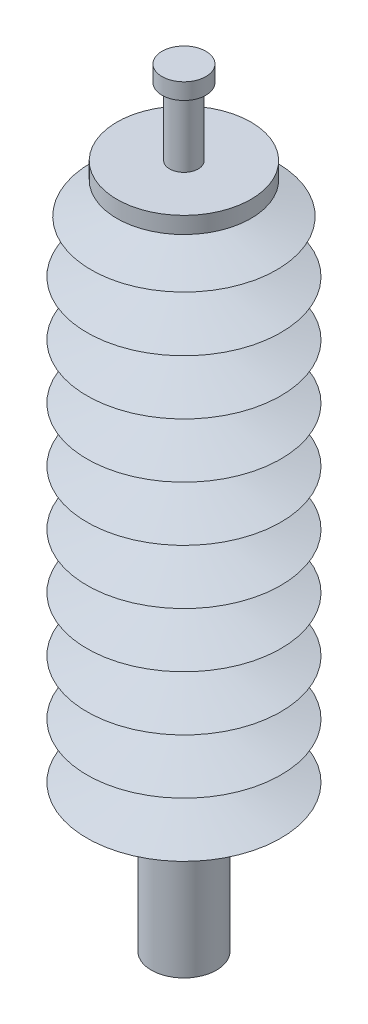
ISO-10303-21;
HEADER;
FILE_DESCRIPTION(('STEP AP214'),'2;1');
FILE_NAME('part.step','',(''),(''),'','','');
FILE_SCHEMA(('AUTOMOTIVE_DESIGN { 1 0 10303 214 1 1 1 1 }'));
ENDSEC;
DATA;
#1=APPLICATION_CONTEXT('core data for automotive mechanical design processes');
#2=APPLICATION_PROTOCOL_DEFINITION('international standard','automotive_design',2000,#1);
#3=PRODUCT_CONTEXT('',#1,'mechanical');
#4=PRODUCT('Part','Part','',(#3));
#5=PRODUCT_RELATED_PRODUCT_CATEGORY('part','',(#4));
#6=PRODUCT_DEFINITION_FORMATION('','',#4);
#7=PRODUCT_DEFINITION_CONTEXT('part definition',#1,'design');
#8=PRODUCT_DEFINITION('design','',#6,#7);
#9=PRODUCT_DEFINITION_SHAPE('','',#8);
#10=(LENGTH_UNIT() NAMED_UNIT(*) SI_UNIT(.MILLI.,.METRE.));
#11=(NAMED_UNIT(*) PLANE_ANGLE_UNIT() SI_UNIT($,.RADIAN.));
#12=(NAMED_UNIT(*) SI_UNIT($,.STERADIAN.) SOLID_ANGLE_UNIT());
#13=UNCERTAINTY_MEASURE_WITH_UNIT(LENGTH_MEASURE(1.E-05),#10,'distance_accuracy_value','');
#14=(GEOMETRIC_REPRESENTATION_CONTEXT(3) GLOBAL_UNCERTAINTY_ASSIGNED_CONTEXT((#13)) GLOBAL_UNIT_ASSIGNED_CONTEXT((#10,
#11,#12)) REPRESENTATION_CONTEXT('',''));
#15=CARTESIAN_POINT('',(0.,0.,0.));
#16=DIRECTION('',(0.,0.,1.));
#17=DIRECTION('',(1.,0.,0.));
#18=AXIS2_PLACEMENT_3D('',#15,#16,#17);
#19=CARTESIAN_POINT('',(50.,0.,0.));
#20=DIRECTION('',(0.,-1.,0.));
#21=DIRECTION('',(0.,0.,-1.));
#22=AXIS2_PLACEMENT_3D('',#19,#20,#21);
#23=PLANE('',#22);
#24=CARTESIAN_POINT('',(0.,0.,0.));
#25=DIRECTION('',(0.,-1.,0.));
#26=DIRECTION('',(0.,0.,-1.));
#27=AXIS2_PLACEMENT_3D('',#24,#25,#26);
#28=CIRCLE('',#27,50.);
#29=CARTESIAN_POINT('',(0.,0.,-50.));
#30=VERTEX_POINT('',#29);
#31=EDGE_CURVE('E122',#30,#30,#28,.T.);
#32=ORIENTED_EDGE('',*,*,#31,.T.);
#33=EDGE_LOOP('',(#32));
#34=FACE_BOUND('',#33,.T.);
#35=ADVANCED_FACE('F31',(#34),#23,.T.);
#36=CARTESIAN_POINT('',(33.6784208654145,1179.59682521673,0.));
#37=DIRECTION('',(0.,1.,0.));
#38=DIRECTION('',(0.,0.,1.));
#39=AXIS2_PLACEMENT_3D('',#36,#37,#38);
#40=PLANE('',#39);
#41=CARTESIAN_POINT('',(0.,1179.59682521673,0.));
#42=DIRECTION('',(0.,-1.,0.));
#43=DIRECTION('',(0.,0.,-1.));
#44=AXIS2_PLACEMENT_3D('',#41,#42,#43);
#45=CIRCLE('',#44,33.6784208654145);
#46=CARTESIAN_POINT('',(0.,1179.59682521673,-33.6784208654145));
#47=VERTEX_POINT('',#46);
#48=EDGE_CURVE('E10',#47,#47,#45,.T.);
#49=ORIENTED_EDGE('',*,*,#48,.F.);
#50=EDGE_LOOP('',(#49));
#51=FACE_BOUND('',#50,.T.);
#52=ADVANCED_FACE('F139',(#51),#40,.T.);
#53=CARTESIAN_POINT('',(0.,0.,0.));
#54=DIRECTION('',(0.,-1.,0.));
#55=DIRECTION('',(0.,0.,-1.));
#56=AXIS2_PLACEMENT_3D('',#53,#54,#55);
#57=CYLINDRICAL_SURFACE('',#56,33.6784208654145);
#58=ORIENTED_EDGE('',*,*,#48,.T.);
#59=EDGE_LOOP('',(#58));
#60=FACE_BOUND('',#59,.T.);
#61=CARTESIAN_POINT('',(0.,1154.72902220655,0.));
#62=DIRECTION('',(0.,-1.,0.));
#63=DIRECTION('',(0.,0.,-1.));
#64=AXIS2_PLACEMENT_3D('',#61,#62,#63);
#65=CIRCLE('',#64,33.6784208654145);
#66=CARTESIAN_POINT('',(0.,1154.72902220655,-33.6784208654145));
#67=VERTEX_POINT('',#66);
#68=EDGE_CURVE('E37',#67,#67,#65,.T.);
#69=ORIENTED_EDGE('',*,*,#68,.F.);
#70=EDGE_LOOP('',(#69));
#71=FACE_BOUND('',#70,.T.);
#72=ADVANCED_FACE('F143',(#60,#71),#57,.T.);
#73=CARTESIAN_POINT('',(21.9877502011123,1154.72902220655,0.));
#74=DIRECTION('',(0.,-1.,0.));
#75=DIRECTION('',(0.,0.,-1.));
#76=AXIS2_PLACEMENT_3D('',#73,#74,#75);
#77=PLANE('',#76);
#78=ORIENTED_EDGE('',*,*,#68,.T.);
#79=EDGE_LOOP('',(#78));
#80=FACE_BOUND('',#79,.T.);
#81=CARTESIAN_POINT('',(0.,1154.72902220655,0.));
#82=DIRECTION('',(0.,-1.,0.));
#83=DIRECTION('',(0.,0.,-1.));
#84=AXIS2_PLACEMENT_3D('',#81,#82,#83);
#85=CIRCLE('',#84,21.9877502011123);
#86=CARTESIAN_POINT('',(0.,1154.72902220655,-21.9877502011123));
#87=VERTEX_POINT('',#86);
#88=EDGE_CURVE('E41',#87,#87,#85,.T.);
#89=ORIENTED_EDGE('',*,*,#88,.F.);
#90=EDGE_LOOP('',(#89));
#91=FACE_BOUND('',#90,.T.);
#92=ADVANCED_FACE('F148',(#80,#91),#77,.T.);
#93=CARTESIAN_POINT('',(0.,0.,0.));
#94=DIRECTION('',(0.,-1.,0.));
#95=DIRECTION('',(0.,0.,-1.));
#96=AXIS2_PLACEMENT_3D('',#93,#94,#95);
#97=CYLINDRICAL_SURFACE('',#96,21.9877502011123);
#98=ORIENTED_EDGE('',*,*,#88,.T.);
#99=EDGE_LOOP('',(#98));
#100=FACE_BOUND('',#99,.T.);
#101=CARTESIAN_POINT('',(0.,1050.93932575058,0.));
#102=DIRECTION('',(0.,-1.,0.));
#103=DIRECTION('',(0.,0.,-1.));
#104=AXIS2_PLACEMENT_3D('',#101,#102,#103);
#105=CIRCLE('',#104,21.9877502011123);
#106=CARTESIAN_POINT('',(0.,1050.93932575058,-21.9877502011123));
#107=VERTEX_POINT('',#106);
#108=EDGE_CURVE('E45',#107,#107,#105,.T.);
#109=ORIENTED_EDGE('',*,*,#108,.F.);
#110=EDGE_LOOP('',(#109));
#111=FACE_BOUND('',#110,.T.);
#112=ADVANCED_FACE('F153',(#100,#111),#97,.T.);
#113=CARTESIAN_POINT('',(21.9877502011123,1050.93932575058,0.));
#114=DIRECTION('',(0.,1.,0.));
#115=DIRECTION('',(0.,0.,1.));
#116=AXIS2_PLACEMENT_3D('',#113,#114,#115);
#117=PLANE('',#116);
#118=ORIENTED_EDGE('',*,*,#108,.T.);
#119=EDGE_LOOP('',(#118));
#120=FACE_BOUND('',#119,.T.);
#121=CARTESIAN_POINT('',(0.,1050.93932575058,0.));
#122=DIRECTION('',(0.,-1.,0.));
#123=DIRECTION('',(0.,0.,-1.));
#124=AXIS2_PLACEMENT_3D('',#121,#122,#123);
#125=CIRCLE('',#124,102.820969976905);
#126=CARTESIAN_POINT('',(0.,1050.93932575058,-102.820969976905));
#127=VERTEX_POINT('',#126);
#128=EDGE_CURVE('E50',#127,#127,#125,.T.);
#129=ORIENTED_EDGE('',*,*,#128,.F.);
#130=EDGE_LOOP('',(#129));
#131=FACE_BOUND('',#130,.T.);
#132=ADVANCED_FACE('F156',(#120,#131),#117,.T.);
#133=CARTESIAN_POINT('',(0.,0.,0.));
#134=DIRECTION('',(0.,-1.,0.));
#135=DIRECTION('',(0.,0.,-1.));
#136=AXIS2_PLACEMENT_3D('',#133,#134,#135);
#137=CYLINDRICAL_SURFACE('',#136,102.820969976905);
#138=ORIENTED_EDGE('',*,*,#128,.T.);
#139=EDGE_LOOP('',(#138));
#140=FACE_BOUND('',#139,.T.);
#141=CARTESIAN_POINT('',(0.,1025.46966287529,0.));
#142=DIRECTION('',(0.,-1.,0.));
#143=DIRECTION('',(0.,0.,-1.));
#144=AXIS2_PLACEMENT_3D('',#141,#142,#143);
#145=CIRCLE('',#144,102.820969976905);
#146=CARTESIAN_POINT('',(0.,1025.46966287529,-102.820969976905));
#147=VERTEX_POINT('',#146);
#148=EDGE_CURVE('E53',#147,#147,#145,.T.);
#149=ORIENTED_EDGE('',*,*,#148,.F.);
#150=EDGE_LOOP('',(#149));
#151=FACE_BOUND('',#150,.T.);
#152=ADVANCED_FACE('F160',(#140,#151),#137,.T.);
#153=CARTESIAN_POINT('',(102.820969976905,1025.46966287529,0.));
#154=DIRECTION('',(0.,-1.,0.));
#155=DIRECTION('',(0.,0.,-1.));
#156=AXIS2_PLACEMENT_3D('',#153,#154,#155);
#157=PLANE('',#156);
#158=ORIENTED_EDGE('',*,*,#148,.T.);
#159=EDGE_LOOP('',(#158));
#160=FACE_BOUND('',#159,.T.);
#161=CARTESIAN_POINT('',(0.,1025.46966287529,0.));
#162=DIRECTION('',(0.,-1.,0.));
#163=DIRECTION('',(0.,0.,-1.));
#164=AXIS2_PLACEMENT_3D('',#161,#162,#163);
#165=CIRCLE('',#164,49.9999999999995);
#166=CARTESIAN_POINT('',(0.,1025.46966287529,-49.9999999999995));
#167=VERTEX_POINT('',#166);
#168=EDGE_CURVE('E56',#167,#167,#165,.T.);
#169=ORIENTED_EDGE('',*,*,#168,.F.);
#170=EDGE_LOOP('',(#169));
#171=FACE_BOUND('',#170,.T.);
#172=ADVANCED_FACE('F164',(#160,#171),#157,.T.);
#173=CARTESIAN_POINT('',(0.,0.,0.));
#174=DIRECTION('',(0.,-1.,0.));
#175=DIRECTION('',(0.,0.,-1.));
#176=AXIS2_PLACEMENT_3D('',#173,#174,#175);
#177=CYLINDRICAL_SURFACE('',#176,49.9999999999996);
#178=ORIENTED_EDGE('',*,*,#168,.T.);
#179=EDGE_LOOP('',(#178));
#180=FACE_BOUND('',#179,.T.);
#181=CARTESIAN_POINT('',(0.,1000.,0.));
#182=DIRECTION('',(0.,-1.,0.));
#183=DIRECTION('',(0.,0.,-1.));
#184=AXIS2_PLACEMENT_3D('',#181,#182,#183);
#185=CIRCLE('',#184,49.9999999999996);
#186=CARTESIAN_POINT('',(0.,1000.,-49.9999999999996));
#187=VERTEX_POINT('',#186);
#188=EDGE_CURVE('E59',#187,#187,#185,.T.);
#189=ORIENTED_EDGE('',*,*,#188,.F.);
#190=EDGE_LOOP('',(#189));
#191=FACE_BOUND('',#190,.T.);
#192=ADVANCED_FACE('F168',(#180,#191),#177,.T.);
#193=CARTESIAN_POINT('',(0.,976.98996778291,0.));
#194=DIRECTION('',(0.,-1.,0.));
#195=DIRECTION('',(0.,0.,-1.));
#196=AXIS2_PLACEMENT_3D('',#193,#194,#195);
#197=CONICAL_SURFACE('',#196,142.436697459584,1.32682736848839);
#198=ORIENTED_EDGE('',*,*,#188,.T.);
#199=EDGE_LOOP('',(#198));
#200=FACE_BOUND('',#199,.T.);
#201=CARTESIAN_POINT('',(0.,976.98996778291,0.));
#202=DIRECTION('',(0.,-1.,0.));
#203=DIRECTION('',(0.,0.,-1.));
#204=AXIS2_PLACEMENT_3D('',#201,#202,#203);
#205=CIRCLE('',#204,142.436697459584);
#206=CARTESIAN_POINT('',(0.,976.98996778291,-142.436697459584));
#207=VERTEX_POINT('',#206);
#208=EDGE_CURVE('E62',#207,#207,#205,.T.);
#209=ORIENTED_EDGE('',*,*,#208,.F.);
#210=EDGE_LOOP('',(#209));
#211=FACE_BOUND('',#210,.T.);
#212=ADVANCED_FACE('F172',(#200,#211),#197,.T.);
#213=CARTESIAN_POINT('',(0.,921.400938378422,0.));
#214=DIRECTION('',(0.,1.,0.));
#215=DIRECTION('',(0.,0.,1.));
#216=AXIS2_PLACEMENT_3D('',#213,#214,#215);
#217=CONICAL_SURFACE('',#216,49.9999999999996,1.02936712170393);
#218=ORIENTED_EDGE('',*,*,#208,.T.);
#219=EDGE_LOOP('',(#218));
#220=FACE_BOUND('',#219,.T.);
#221=CARTESIAN_POINT('',(0.,921.400938378422,0.));
#222=DIRECTION('',(0.,-1.,0.));
#223=DIRECTION('',(0.,0.,-1.));
#224=AXIS2_PLACEMENT_3D('',#221,#222,#223);
#225=CIRCLE('',#224,49.9999999999996);
#226=CARTESIAN_POINT('',(0.,921.400938378422,-49.9999999999996));
#227=VERTEX_POINT('',#226);
#228=EDGE_CURVE('E65',#227,#227,#225,.T.);
#229=ORIENTED_EDGE('',*,*,#228,.F.);
#230=EDGE_LOOP('',(#229));
#231=FACE_BOUND('',#230,.T.);
#232=ADVANCED_FACE('F176',(#220,#231),#217,.T.);
#233=CARTESIAN_POINT('',(0.,896.810317934068,0.));
#234=DIRECTION('',(0.,-1.,0.));
#235=DIRECTION('',(0.,0.,-1.));
#236=AXIS2_PLACEMENT_3D('',#233,#234,#235);
#237=CONICAL_SURFACE('',#236,148.786291166946,1.32682736848839);
#238=ORIENTED_EDGE('',*,*,#228,.T.);
#239=EDGE_LOOP('',(#238));
#240=FACE_BOUND('',#239,.T.);
#241=CARTESIAN_POINT('',(0.,896.810317934068,0.));
#242=DIRECTION('',(0.,-1.,0.));
#243=DIRECTION('',(0.,0.,-1.));
#244=AXIS2_PLACEMENT_3D('',#241,#242,#243);
#245=CIRCLE('',#244,148.786291166946);
#246=CARTESIAN_POINT('',(0.,896.810317934068,-148.786291166946));
#247=VERTEX_POINT('',#246);
#248=EDGE_CURVE('E68',#247,#247,#245,.T.);
#249=ORIENTED_EDGE('',*,*,#248,.F.);
#250=EDGE_LOOP('',(#249));
#251=FACE_BOUND('',#250,.T.);
#252=ADVANCED_FACE('F180',(#240,#251),#237,.T.);
#253=CARTESIAN_POINT('',(0.,837.402807763762,0.));
#254=DIRECTION('',(0.,1.,0.));
#255=DIRECTION('',(0.,0.,1.));
#256=AXIS2_PLACEMENT_3D('',#253,#254,#255);
#257=CONICAL_SURFACE('',#256,49.9999999999996,1.02936712170394);
#258=ORIENTED_EDGE('',*,*,#248,.T.);
#259=EDGE_LOOP('',(#258));
#260=FACE_BOUND('',#259,.T.);
#261=CARTESIAN_POINT('',(0.,837.402807763762,0.));
#262=DIRECTION('',(0.,-1.,0.));
#263=DIRECTION('',(0.,0.,-1.));
#264=AXIS2_PLACEMENT_3D('',#261,#262,#263);
#265=CIRCLE('',#264,49.9999999999996);
#266=CARTESIAN_POINT('',(0.,837.402807763762,-49.9999999999996));
#267=VERTEX_POINT('',#266);
#268=EDGE_CURVE('E71',#267,#267,#265,.T.);
#269=ORIENTED_EDGE('',*,*,#268,.F.);
#270=EDGE_LOOP('',(#269));
#271=FACE_BOUND('',#270,.T.);
#272=ADVANCED_FACE('F184',(#260,#271),#257,.T.);
#273=CARTESIAN_POINT('',(0.,812.812187319408,0.));
#274=DIRECTION('',(0.,-1.,0.));
#275=DIRECTION('',(0.,0.,-1.));
#276=AXIS2_PLACEMENT_3D('',#273,#274,#275);
#277=CONICAL_SURFACE('',#276,148.786291166946,1.32682736848839);
#278=ORIENTED_EDGE('',*,*,#268,.T.);
#279=EDGE_LOOP('',(#278));
#280=FACE_BOUND('',#279,.T.);
#281=CARTESIAN_POINT('',(0.,812.812187319408,0.));
#282=DIRECTION('',(0.,-1.,0.));
#283=DIRECTION('',(0.,0.,-1.));
#284=AXIS2_PLACEMENT_3D('',#281,#282,#283);
#285=CIRCLE('',#284,148.786291166946);
#286=CARTESIAN_POINT('',(0.,812.812187319408,-148.786291166946));
#287=VERTEX_POINT('',#286);
#288=EDGE_CURVE('E74',#287,#287,#285,.T.);
#289=ORIENTED_EDGE('',*,*,#288,.F.);
#290=EDGE_LOOP('',(#289));
#291=FACE_BOUND('',#290,.T.);
#292=ADVANCED_FACE('F188',(#280,#291),#277,.T.);
#293=CARTESIAN_POINT('',(0.,753.404677149102,0.));
#294=DIRECTION('',(0.,1.,0.));
#295=DIRECTION('',(0.,0.,1.));
#296=AXIS2_PLACEMENT_3D('',#293,#294,#295);
#297=CONICAL_SURFACE('',#296,49.9999999999996,1.02936712170394);
#298=ORIENTED_EDGE('',*,*,#288,.T.);
#299=EDGE_LOOP('',(#298));
#300=FACE_BOUND('',#299,.T.);
#301=CARTESIAN_POINT('',(0.,753.404677149102,0.));
#302=DIRECTION('',(0.,-1.,0.));
#303=DIRECTION('',(0.,0.,-1.));
#304=AXIS2_PLACEMENT_3D('',#301,#302,#303);
#305=CIRCLE('',#304,49.9999999999996);
#306=CARTESIAN_POINT('',(0.,753.404677149102,-49.9999999999996));
#307=VERTEX_POINT('',#306);
#308=EDGE_CURVE('E77',#307,#307,#305,.T.);
#309=ORIENTED_EDGE('',*,*,#308,.F.);
#310=EDGE_LOOP('',(#309));
#311=FACE_BOUND('',#310,.T.);
#312=ADVANCED_FACE('F192',(#300,#311),#297,.T.);
#313=CARTESIAN_POINT('',(0.,728.814056704748,0.));
#314=DIRECTION('',(0.,-1.,0.));
#315=DIRECTION('',(0.,0.,-1.));
#316=AXIS2_PLACEMENT_3D('',#313,#314,#315);
#317=CONICAL_SURFACE('',#316,148.786291166946,1.32682736848839);
#318=ORIENTED_EDGE('',*,*,#308,.T.);
#319=EDGE_LOOP('',(#318));
#320=FACE_BOUND('',#319,.T.);
#321=CARTESIAN_POINT('',(0.,728.814056704748,0.));
#322=DIRECTION('',(0.,-1.,0.));
#323=DIRECTION('',(0.,0.,-1.));
#324=AXIS2_PLACEMENT_3D('',#321,#322,#323);
#325=CIRCLE('',#324,148.786291166946);
#326=CARTESIAN_POINT('',(0.,728.814056704748,-148.786291166946));
#327=VERTEX_POINT('',#326);
#328=EDGE_CURVE('E80',#327,#327,#325,.T.);
#329=ORIENTED_EDGE('',*,*,#328,.F.);
#330=EDGE_LOOP('',(#329));
#331=FACE_BOUND('',#330,.T.);
#332=ADVANCED_FACE('F196',(#320,#331),#317,.T.);
#333=CARTESIAN_POINT('',(0.,669.406546534442,0.));
#334=DIRECTION('',(0.,1.,0.));
#335=DIRECTION('',(0.,0.,1.));
#336=AXIS2_PLACEMENT_3D('',#333,#334,#335);
#337=CONICAL_SURFACE('',#336,49.9999999999997,1.02936712170394);
#338=ORIENTED_EDGE('',*,*,#328,.T.);
#339=EDGE_LOOP('',(#338));
#340=FACE_BOUND('',#339,.T.);
#341=CARTESIAN_POINT('',(0.,669.406546534442,0.));
#342=DIRECTION('',(0.,-1.,0.));
#343=DIRECTION('',(0.,0.,-1.));
#344=AXIS2_PLACEMENT_3D('',#341,#342,#343);
#345=CIRCLE('',#344,49.9999999999997);
#346=CARTESIAN_POINT('',(0.,669.406546534442,-49.9999999999997));
#347=VERTEX_POINT('',#346);
#348=EDGE_CURVE('E83',#347,#347,#345,.T.);
#349=ORIENTED_EDGE('',*,*,#348,.F.);
#350=EDGE_LOOP('',(#349));
#351=FACE_BOUND('',#350,.T.);
#352=ADVANCED_FACE('F200',(#340,#351),#337,.T.);
#353=CARTESIAN_POINT('',(0.,644.815926090088,0.));
#354=DIRECTION('',(0.,-1.,0.));
#355=DIRECTION('',(0.,0.,-1.));
#356=AXIS2_PLACEMENT_3D('',#353,#354,#355);
#357=CONICAL_SURFACE('',#356,148.786291166946,1.32682736848839);
#358=ORIENTED_EDGE('',*,*,#348,.T.);
#359=EDGE_LOOP('',(#358));
#360=FACE_BOUND('',#359,.T.);
#361=CARTESIAN_POINT('',(0.,644.815926090088,0.));
#362=DIRECTION('',(0.,-1.,0.));
#363=DIRECTION('',(0.,0.,-1.));
#364=AXIS2_PLACEMENT_3D('',#361,#362,#363);
#365=CIRCLE('',#364,148.786291166946);
#366=CARTESIAN_POINT('',(0.,644.815926090088,-148.786291166946));
#367=VERTEX_POINT('',#366);
#368=EDGE_CURVE('E86',#367,#367,#365,.T.);
#369=ORIENTED_EDGE('',*,*,#368,.F.);
#370=EDGE_LOOP('',(#369));
#371=FACE_BOUND('',#370,.T.);
#372=ADVANCED_FACE('F204',(#360,#371),#357,.T.);
#373=CARTESIAN_POINT('',(0.,585.408415919782,0.));
#374=DIRECTION('',(0.,1.,0.));
#375=DIRECTION('',(0.,0.,1.));
#376=AXIS2_PLACEMENT_3D('',#373,#374,#375);
#377=CONICAL_SURFACE('',#376,49.9999999999996,1.02936712170394);
#378=ORIENTED_EDGE('',*,*,#368,.T.);
#379=EDGE_LOOP('',(#378));
#380=FACE_BOUND('',#379,.T.);
#381=CARTESIAN_POINT('',(0.,585.408415919782,0.));
#382=DIRECTION('',(0.,-1.,0.));
#383=DIRECTION('',(0.,0.,-1.));
#384=AXIS2_PLACEMENT_3D('',#381,#382,#383);
#385=CIRCLE('',#384,49.9999999999996);
#386=CARTESIAN_POINT('',(0.,585.408415919782,-49.9999999999996));
#387=VERTEX_POINT('',#386);
#388=EDGE_CURVE('E89',#387,#387,#385,.T.);
#389=ORIENTED_EDGE('',*,*,#388,.F.);
#390=EDGE_LOOP('',(#389));
#391=FACE_BOUND('',#390,.T.);
#392=ADVANCED_FACE('F208',(#380,#391),#377,.T.);
#393=CARTESIAN_POINT('',(0.,560.817795475428,0.));
#394=DIRECTION('',(0.,-1.,0.));
#395=DIRECTION('',(0.,0.,-1.));
#396=AXIS2_PLACEMENT_3D('',#393,#394,#395);
#397=CONICAL_SURFACE('',#396,148.786291166946,1.32682736848839);
#398=ORIENTED_EDGE('',*,*,#388,.T.);
#399=EDGE_LOOP('',(#398));
#400=FACE_BOUND('',#399,.T.);
#401=CARTESIAN_POINT('',(0.,560.817795475428,0.));
#402=DIRECTION('',(0.,-1.,0.));
#403=DIRECTION('',(0.,0.,-1.));
#404=AXIS2_PLACEMENT_3D('',#401,#402,#403);
#405=CIRCLE('',#404,148.786291166946);
#406=CARTESIAN_POINT('',(0.,560.817795475428,-148.786291166946));
#407=VERTEX_POINT('',#406);
#408=EDGE_CURVE('E92',#407,#407,#405,.T.);
#409=ORIENTED_EDGE('',*,*,#408,.F.);
#410=EDGE_LOOP('',(#409));
#411=FACE_BOUND('',#410,.T.);
#412=ADVANCED_FACE('F212',(#400,#411),#397,.T.);
#413=CARTESIAN_POINT('',(0.,501.410285305122,0.));
#414=DIRECTION('',(0.,1.,0.));
#415=DIRECTION('',(0.,0.,1.));
#416=AXIS2_PLACEMENT_3D('',#413,#414,#415);
#417=CONICAL_SURFACE('',#416,49.9999999999997,1.02936712170393);
#418=ORIENTED_EDGE('',*,*,#408,.T.);
#419=EDGE_LOOP('',(#418));
#420=FACE_BOUND('',#419,.T.);
#421=CARTESIAN_POINT('',(0.,501.410285305122,0.));
#422=DIRECTION('',(0.,-1.,0.));
#423=DIRECTION('',(0.,0.,-1.));
#424=AXIS2_PLACEMENT_3D('',#421,#422,#423);
#425=CIRCLE('',#424,49.9999999999997);
#426=CARTESIAN_POINT('',(0.,501.410285305122,-49.9999999999997));
#427=VERTEX_POINT('',#426);
#428=EDGE_CURVE('E95',#427,#427,#425,.T.);
#429=ORIENTED_EDGE('',*,*,#428,.F.);
#430=EDGE_LOOP('',(#429));
#431=FACE_BOUND('',#430,.T.);
#432=ADVANCED_FACE('F216',(#420,#431),#417,.T.);
#433=CARTESIAN_POINT('',(0.,476.819664860768,0.));
#434=DIRECTION('',(0.,-1.,0.));
#435=DIRECTION('',(0.,0.,-1.));
#436=AXIS2_PLACEMENT_3D('',#433,#434,#435);
#437=CONICAL_SURFACE('',#436,148.786291166947,1.32682736848839);
#438=ORIENTED_EDGE('',*,*,#428,.T.);
#439=EDGE_LOOP('',(#438));
#440=FACE_BOUND('',#439,.T.);
#441=CARTESIAN_POINT('',(0.,476.819664860768,0.));
#442=DIRECTION('',(0.,-1.,0.));
#443=DIRECTION('',(0.,0.,-1.));
#444=AXIS2_PLACEMENT_3D('',#441,#442,#443);
#445=CIRCLE('',#444,148.786291166947);
#446=CARTESIAN_POINT('',(0.,476.819664860768,-148.786291166947));
#447=VERTEX_POINT('',#446);
#448=EDGE_CURVE('E98',#447,#447,#445,.T.);
#449=ORIENTED_EDGE('',*,*,#448,.F.);
#450=EDGE_LOOP('',(#449));
#451=FACE_BOUND('',#450,.T.);
#452=ADVANCED_FACE('F220',(#440,#451),#437,.T.);
#453=CARTESIAN_POINT('',(0.,417.412154690462,0.));
#454=DIRECTION('',(0.,1.,0.));
#455=DIRECTION('',(0.,0.,1.));
#456=AXIS2_PLACEMENT_3D('',#453,#454,#455);
#457=CONICAL_SURFACE('',#456,49.9999999999998,1.02936712170394);
#458=ORIENTED_EDGE('',*,*,#448,.T.);
#459=EDGE_LOOP('',(#458));
#460=FACE_BOUND('',#459,.T.);
#461=CARTESIAN_POINT('',(0.,417.412154690462,0.));
#462=DIRECTION('',(0.,-1.,0.));
#463=DIRECTION('',(0.,0.,-1.));
#464=AXIS2_PLACEMENT_3D('',#461,#462,#463);
#465=CIRCLE('',#464,49.9999999999998);
#466=CARTESIAN_POINT('',(0.,417.412154690462,-49.9999999999998));
#467=VERTEX_POINT('',#466);
#468=EDGE_CURVE('E101',#467,#467,#465,.T.);
#469=ORIENTED_EDGE('',*,*,#468,.F.);
#470=EDGE_LOOP('',(#469));
#471=FACE_BOUND('',#470,.T.);
#472=ADVANCED_FACE('F224',(#460,#471),#457,.T.);
#473=CARTESIAN_POINT('',(0.,392.821534246108,0.));
#474=DIRECTION('',(0.,-1.,0.));
#475=DIRECTION('',(0.,0.,-1.));
#476=AXIS2_PLACEMENT_3D('',#473,#474,#475);
#477=CONICAL_SURFACE('',#476,148.786291166947,1.32682736848839);
#478=ORIENTED_EDGE('',*,*,#468,.T.);
#479=EDGE_LOOP('',(#478));
#480=FACE_BOUND('',#479,.T.);
#481=CARTESIAN_POINT('',(0.,392.821534246108,0.));
#482=DIRECTION('',(0.,-1.,0.));
#483=DIRECTION('',(0.,0.,-1.));
#484=AXIS2_PLACEMENT_3D('',#481,#482,#483);
#485=CIRCLE('',#484,148.786291166947);
#486=CARTESIAN_POINT('',(0.,392.821534246108,-148.786291166947));
#487=VERTEX_POINT('',#486);
#488=EDGE_CURVE('E104',#487,#487,#485,.T.);
#489=ORIENTED_EDGE('',*,*,#488,.F.);
#490=EDGE_LOOP('',(#489));
#491=FACE_BOUND('',#490,.T.);
#492=ADVANCED_FACE('F228',(#480,#491),#477,.T.);
#493=CARTESIAN_POINT('',(0.,333.414024075802,0.));
#494=DIRECTION('',(0.,1.,0.));
#495=DIRECTION('',(0.,0.,1.));
#496=AXIS2_PLACEMENT_3D('',#493,#494,#495);
#497=CONICAL_SURFACE('',#496,49.9999999999999,1.02936712170394);
#498=ORIENTED_EDGE('',*,*,#488,.T.);
#499=EDGE_LOOP('',(#498));
#500=FACE_BOUND('',#499,.T.);
#501=CARTESIAN_POINT('',(0.,333.414024075802,0.));
#502=DIRECTION('',(0.,-1.,0.));
#503=DIRECTION('',(0.,0.,-1.));
#504=AXIS2_PLACEMENT_3D('',#501,#502,#503);
#505=CIRCLE('',#504,49.9999999999999);
#506=CARTESIAN_POINT('',(0.,333.414024075802,-49.9999999999999));
#507=VERTEX_POINT('',#506);
#508=EDGE_CURVE('E107',#507,#507,#505,.T.);
#509=ORIENTED_EDGE('',*,*,#508,.F.);
#510=EDGE_LOOP('',(#509));
#511=FACE_BOUND('',#510,.T.);
#512=ADVANCED_FACE('F232',(#500,#511),#497,.T.);
#513=CARTESIAN_POINT('',(0.,308.823403631448,0.));
#514=DIRECTION('',(0.,-1.,0.));
#515=DIRECTION('',(0.,0.,-1.));
#516=AXIS2_PLACEMENT_3D('',#513,#514,#515);
#517=CONICAL_SURFACE('',#516,148.786291166947,1.32682736848839);
#518=ORIENTED_EDGE('',*,*,#508,.T.);
#519=EDGE_LOOP('',(#518));
#520=FACE_BOUND('',#519,.T.);
#521=CARTESIAN_POINT('',(0.,308.823403631448,0.));
#522=DIRECTION('',(0.,-1.,0.));
#523=DIRECTION('',(0.,0.,-1.));
#524=AXIS2_PLACEMENT_3D('',#521,#522,#523);
#525=CIRCLE('',#524,148.786291166947);
#526=CARTESIAN_POINT('',(0.,308.823403631448,-148.786291166947));
#527=VERTEX_POINT('',#526);
#528=EDGE_CURVE('E110',#527,#527,#525,.T.);
#529=ORIENTED_EDGE('',*,*,#528,.F.);
#530=EDGE_LOOP('',(#529));
#531=FACE_BOUND('',#530,.T.);
#532=ADVANCED_FACE('F236',(#520,#531),#517,.T.);
#533=CARTESIAN_POINT('',(0.,249.415893461142,0.));
#534=DIRECTION('',(0.,1.,0.));
#535=DIRECTION('',(0.,0.,1.));
#536=AXIS2_PLACEMENT_3D('',#533,#534,#535);
#537=CONICAL_SURFACE('',#536,49.9999999999999,1.02936712170394);
#538=ORIENTED_EDGE('',*,*,#528,.T.);
#539=EDGE_LOOP('',(#538));
#540=FACE_BOUND('',#539,.T.);
#541=CARTESIAN_POINT('',(0.,249.415893461142,0.));
#542=DIRECTION('',(0.,-1.,0.));
#543=DIRECTION('',(0.,0.,-1.));
#544=AXIS2_PLACEMENT_3D('',#541,#542,#543);
#545=CIRCLE('',#544,49.9999999999999);
#546=CARTESIAN_POINT('',(0.,249.415893461142,-49.9999999999999));
#547=VERTEX_POINT('',#546);
#548=EDGE_CURVE('E113',#547,#547,#545,.T.);
#549=ORIENTED_EDGE('',*,*,#548,.F.);
#550=EDGE_LOOP('',(#549));
#551=FACE_BOUND('',#550,.T.);
#552=ADVANCED_FACE('F240',(#540,#551),#537,.T.);
#553=CARTESIAN_POINT('',(0.,224.825273016788,0.));
#554=DIRECTION('',(0.,-1.,0.));
#555=DIRECTION('',(0.,0.,-1.));
#556=AXIS2_PLACEMENT_3D('',#553,#554,#555);
#557=CONICAL_SURFACE('',#556,148.786291166947,1.32682736848839);
#558=ORIENTED_EDGE('',*,*,#548,.T.);
#559=EDGE_LOOP('',(#558));
#560=FACE_BOUND('',#559,.T.);
#561=CARTESIAN_POINT('',(0.,224.825273016788,0.));
#562=DIRECTION('',(0.,-1.,0.));
#563=DIRECTION('',(0.,0.,-1.));
#564=AXIS2_PLACEMENT_3D('',#561,#562,#563);
#565=CIRCLE('',#564,148.786291166947);
#566=CARTESIAN_POINT('',(0.,224.825273016788,-148.786291166947));
#567=VERTEX_POINT('',#566);
#568=EDGE_CURVE('E116',#567,#567,#565,.T.);
#569=ORIENTED_EDGE('',*,*,#568,.F.);
#570=EDGE_LOOP('',(#569));
#571=FACE_BOUND('',#570,.T.);
#572=ADVANCED_FACE('F135',(#560,#571),#557,.T.);
#573=CARTESIAN_POINT('',(0.,165.417762846482,0.));
#574=DIRECTION('',(0.,1.,0.));
#575=DIRECTION('',(0.,0.,1.));
#576=AXIS2_PLACEMENT_3D('',#573,#574,#575);
#577=CONICAL_SURFACE('',#576,50.,1.02936712170394);
#578=ORIENTED_EDGE('',*,*,#568,.T.);
#579=EDGE_LOOP('',(#578));
#580=FACE_BOUND('',#579,.T.);
#581=CARTESIAN_POINT('',(0.,165.417762846482,0.));
#582=DIRECTION('',(0.,-1.,0.));
#583=DIRECTION('',(0.,0.,-1.));
#584=AXIS2_PLACEMENT_3D('',#581,#582,#583);
#585=CIRCLE('',#584,50.);
#586=CARTESIAN_POINT('',(0.,165.417762846482,-50.));
#587=VERTEX_POINT('',#586);
#588=EDGE_CURVE('E119',#587,#587,#585,.T.);
#589=ORIENTED_EDGE('',*,*,#588,.F.);
#590=EDGE_LOOP('',(#589));
#591=FACE_BOUND('',#590,.T.);
#592=ADVANCED_FACE('F129',(#580,#591),#577,.T.);
#593=CARTESIAN_POINT('',(0.,0.,0.));
#594=DIRECTION('',(0.,-1.,0.));
#595=DIRECTION('',(0.,0.,-1.));
#596=AXIS2_PLACEMENT_3D('',#593,#594,#595);
#597=CYLINDRICAL_SURFACE('',#596,50.);
#598=ORIENTED_EDGE('',*,*,#588,.T.);
#599=EDGE_LOOP('',(#598));
#600=FACE_BOUND('',#599,.T.);
#601=ORIENTED_EDGE('',*,*,#31,.F.);
#602=EDGE_LOOP('',(#601));
#603=FACE_BOUND('',#602,.T.);
#604=ADVANCED_FACE('F127',(#600,#603),#597,.T.);
#605=CLOSED_SHELL('',(#35,#52,#72,#92,#112,#132,#152,#172,#192,#212,#232,#252,#272,#292,#312,
#332,#352,#372,#392,#412,#432,#452,#472,#492,#512,#532,#552,#572,#592,#604));
#606=MANIFOLD_SOLID_BREP('B2',#605);
#607=ADVANCED_BREP_SHAPE_REPRESENTATION('',(#18,#606),#14);
#608=SHAPE_DEFINITION_REPRESENTATION(#9,#607);
ENDSEC;
END-ISO-10303-21;
